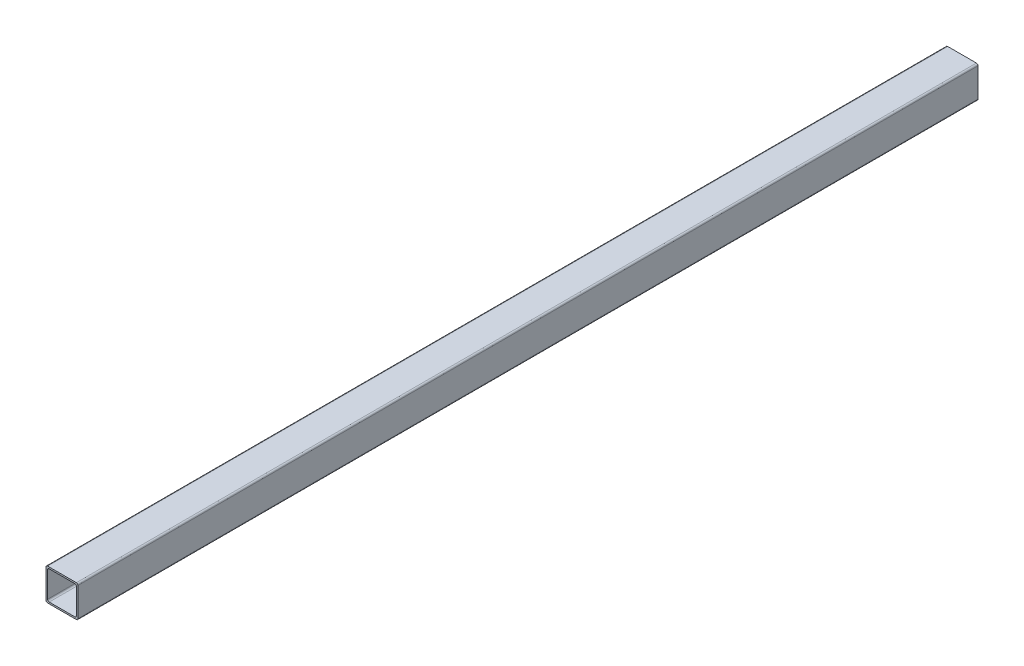
ISO-10303-21;
HEADER;
FILE_DESCRIPTION(('STEP AP214'),'2;1');
FILE_NAME('part.step','',(''),(''),'','','');
FILE_SCHEMA(('AUTOMOTIVE_DESIGN { 1 0 10303 214 1 1 1 1 }'));
ENDSEC;
DATA;
#1=APPLICATION_CONTEXT('core data for automotive mechanical design processes');
#2=APPLICATION_PROTOCOL_DEFINITION('international standard','automotive_design',2000,#1);
#3=PRODUCT_CONTEXT('',#1,'mechanical');
#4=PRODUCT('Part','Part','',(#3));
#5=PRODUCT_RELATED_PRODUCT_CATEGORY('part','',(#4));
#6=PRODUCT_DEFINITION_FORMATION('','',#4);
#7=PRODUCT_DEFINITION_CONTEXT('part definition',#1,'design');
#8=PRODUCT_DEFINITION('design','',#6,#7);
#9=PRODUCT_DEFINITION_SHAPE('','',#8);
#10=(LENGTH_UNIT() NAMED_UNIT(*) SI_UNIT(.MILLI.,.METRE.));
#11=(NAMED_UNIT(*) PLANE_ANGLE_UNIT() SI_UNIT($,.RADIAN.));
#12=(NAMED_UNIT(*) SI_UNIT($,.STERADIAN.) SOLID_ANGLE_UNIT());
#13=UNCERTAINTY_MEASURE_WITH_UNIT(LENGTH_MEASURE(1.E-05),#10,'distance_accuracy_value','');
#14=(GEOMETRIC_REPRESENTATION_CONTEXT(3) GLOBAL_UNCERTAINTY_ASSIGNED_CONTEXT((#13)) GLOBAL_UNIT_ASSIGNED_CONTEXT((#10,
#11,#12)) REPRESENTATION_CONTEXT('',''));
#15=CARTESIAN_POINT('',(0.,0.,0.));
#16=DIRECTION('',(0.,0.,1.));
#17=DIRECTION('',(1.,0.,0.));
#18=AXIS2_PLACEMENT_3D('',#15,#16,#17);
#19=CARTESIAN_POINT('',(3.,0.,1690.));
#20=DIRECTION('',(-1.,0.,0.));
#21=DIRECTION('',(0.,0.,1.));
#22=AXIS2_PLACEMENT_3D('',#19,#20,#21);
#23=PLANE('',#22);
#24=DIRECTION('',(0.,1.,0.));
#25=VECTOR('',#24,1.);
#26=CARTESIAN_POINT('',(3.,0.,0.));
#27=LINE('',#26,#25);
#28=CARTESIAN_POINT('',(3.,6.00000000000002,0.));
#29=VERTEX_POINT('',#28);
#30=CARTESIAN_POINT('',(3.,54.,0.));
#31=VERTEX_POINT('',#30);
#32=EDGE_CURVE('E207',#29,#31,#27,.T.);
#33=ORIENTED_EDGE('',*,*,#32,.T.);
#34=DIRECTION('',(0.,0.,-1.));
#35=VECTOR('',#34,1.);
#36=CARTESIAN_POINT('',(3.,54.,1690.));
#37=LINE('',#36,#35);
#38=CARTESIAN_POINT('',(3.,54.,1690.));
#39=VERTEX_POINT('',#38);
#40=EDGE_CURVE('E11',#39,#31,#37,.T.);
#41=ORIENTED_EDGE('',*,*,#40,.F.);
#42=DIRECTION('',(0.,1.,0.));
#43=VECTOR('',#42,1.);
#44=CARTESIAN_POINT('',(3.,0.,1690.));
#45=LINE('',#44,#43);
#46=CARTESIAN_POINT('',(3.,6.00000000000002,1690.));
#47=VERTEX_POINT('',#46);
#48=EDGE_CURVE('E303',#47,#39,#45,.T.);
#49=ORIENTED_EDGE('',*,*,#48,.F.);
#50=DIRECTION('',(0.,0.,-1.));
#51=VECTOR('',#50,1.);
#52=CARTESIAN_POINT('',(3.,6.00000000000002,1690.));
#53=LINE('',#52,#51);
#54=EDGE_CURVE('E54',#47,#29,#53,.T.);
#55=ORIENTED_EDGE('',*,*,#54,.T.);
#56=EDGE_LOOP('',(#33,#41,#49,#55));
#57=FACE_BOUND('',#56,.T.);
#58=ADVANCED_FACE('F34',(#57),#23,.F.);
#59=CARTESIAN_POINT('',(6.,54.,1690.));
#60=DIRECTION('',(0.,0.,-1.));
#61=DIRECTION('',(-1.,0.,0.));
#62=AXIS2_PLACEMENT_3D('',#59,#60,#61);
#63=CYLINDRICAL_SURFACE('',#62,3.);
#64=CARTESIAN_POINT('',(6.,54.,0.));
#65=DIRECTION('',(0.,0.,1.));
#66=DIRECTION('',(1.,0.,0.));
#67=AXIS2_PLACEMENT_3D('',#64,#65,#66);
#68=CIRCLE('',#67,3.);
#69=CARTESIAN_POINT('',(6.00000000000002,57.,0.));
#70=VERTEX_POINT('',#69);
#71=EDGE_CURVE('E209',#31,#70,#68,.F.);
#72=ORIENTED_EDGE('',*,*,#71,.T.);
#73=DIRECTION('',(0.,0.,-1.));
#74=VECTOR('',#73,1.);
#75=CARTESIAN_POINT('',(6.00000000000002,57.,1690.));
#76=LINE('',#75,#74);
#77=CARTESIAN_POINT('',(6.00000000000002,57.,1690.));
#78=VERTEX_POINT('',#77);
#79=EDGE_CURVE('E45',#78,#70,#76,.T.);
#80=ORIENTED_EDGE('',*,*,#79,.F.);
#81=CARTESIAN_POINT('',(6.,54.,1690.));
#82=DIRECTION('',(0.,0.,1.));
#83=DIRECTION('',(1.,0.,0.));
#84=AXIS2_PLACEMENT_3D('',#81,#82,#83);
#85=CIRCLE('',#84,3.);
#86=EDGE_CURVE('E305',#39,#78,#85,.F.);
#87=ORIENTED_EDGE('',*,*,#86,.F.);
#88=ORIENTED_EDGE('',*,*,#40,.T.);
#89=EDGE_LOOP('',(#72,#80,#87,#88));
#90=FACE_BOUND('',#89,.T.);
#91=ADVANCED_FACE('F330',(#90),#63,.F.);
#92=CARTESIAN_POINT('',(0.,57.,1690.));
#93=DIRECTION('',(0.,1.,0.));
#94=DIRECTION('',(0.,0.,1.));
#95=AXIS2_PLACEMENT_3D('',#92,#93,#94);
#96=PLANE('',#95);
#97=DIRECTION('',(1.,0.,0.));
#98=VECTOR('',#97,1.);
#99=CARTESIAN_POINT('',(0.,57.,0.));
#100=LINE('',#99,#98);
#101=CARTESIAN_POINT('',(54.,57.,0.));
#102=VERTEX_POINT('',#101);
#103=EDGE_CURVE('E211',#70,#102,#100,.T.);
#104=ORIENTED_EDGE('',*,*,#103,.T.);
#105=DIRECTION('',(0.,0.,-1.));
#106=VECTOR('',#105,1.);
#107=CARTESIAN_POINT('',(54.,57.,1690.));
#108=LINE('',#107,#106);
#109=CARTESIAN_POINT('',(54.,57.,1690.));
#110=VERTEX_POINT('',#109);
#111=EDGE_CURVE('E235',#110,#102,#108,.T.);
#112=ORIENTED_EDGE('',*,*,#111,.F.);
#113=DIRECTION('',(1.,0.,0.));
#114=VECTOR('',#113,1.);
#115=CARTESIAN_POINT('',(0.,57.,1690.));
#116=LINE('',#115,#114);
#117=EDGE_CURVE('E307',#78,#110,#116,.T.);
#118=ORIENTED_EDGE('',*,*,#117,.F.);
#119=ORIENTED_EDGE('',*,*,#79,.T.);
#120=EDGE_LOOP('',(#104,#112,#118,#119));
#121=FACE_BOUND('',#120,.T.);
#122=ADVANCED_FACE('F335',(#121),#96,.F.);
#123=CARTESIAN_POINT('',(54.,54.,1690.));
#124=DIRECTION('',(0.,0.,-1.));
#125=DIRECTION('',(-1.,0.,0.));
#126=AXIS2_PLACEMENT_3D('',#123,#124,#125);
#127=CYLINDRICAL_SURFACE('',#126,3.);
#128=CARTESIAN_POINT('',(54.,54.,0.));
#129=DIRECTION('',(0.,0.,1.));
#130=DIRECTION('',(1.,0.,0.));
#131=AXIS2_PLACEMENT_3D('',#128,#129,#130);
#132=CIRCLE('',#131,3.);
#133=CARTESIAN_POINT('',(57.,54.,0.));
#134=VERTEX_POINT('',#133);
#135=EDGE_CURVE('E213',#102,#134,#132,.F.);
#136=ORIENTED_EDGE('',*,*,#135,.T.);
#137=DIRECTION('',(0.,0.,-1.));
#138=VECTOR('',#137,1.);
#139=CARTESIAN_POINT('',(57.,54.,1690.));
#140=LINE('',#139,#138);
#141=CARTESIAN_POINT('',(57.,54.,1690.));
#142=VERTEX_POINT('',#141);
#143=EDGE_CURVE('E232',#142,#134,#140,.T.);
#144=ORIENTED_EDGE('',*,*,#143,.F.);
#145=CARTESIAN_POINT('',(54.,54.,1690.));
#146=DIRECTION('',(0.,0.,1.));
#147=DIRECTION('',(1.,0.,0.));
#148=AXIS2_PLACEMENT_3D('',#145,#146,#147);
#149=CIRCLE('',#148,3.);
#150=EDGE_CURVE('E309',#110,#142,#149,.F.);
#151=ORIENTED_EDGE('',*,*,#150,.F.);
#152=ORIENTED_EDGE('',*,*,#111,.T.);
#153=EDGE_LOOP('',(#136,#144,#151,#152));
#154=FACE_BOUND('',#153,.T.);
#155=ADVANCED_FACE('F368',(#154),#127,.F.);
#156=CARTESIAN_POINT('',(57.,0.,1690.));
#157=DIRECTION('',(-1.,0.,0.));
#158=DIRECTION('',(0.,0.,1.));
#159=AXIS2_PLACEMENT_3D('',#156,#157,#158);
#160=PLANE('',#159);
#161=DIRECTION('',(0.,1.,0.));
#162=VECTOR('',#161,1.);
#163=CARTESIAN_POINT('',(57.,0.,0.));
#164=LINE('',#163,#162);
#165=CARTESIAN_POINT('',(57.,6.00000000000002,0.));
#166=VERTEX_POINT('',#165);
#167=EDGE_CURVE('E216',#166,#134,#164,.T.);
#168=ORIENTED_EDGE('',*,*,#167,.F.);
#169=DIRECTION('',(0.,0.,-1.));
#170=VECTOR('',#169,1.);
#171=CARTESIAN_POINT('',(57.,6.00000000000002,1690.));
#172=LINE('',#171,#170);
#173=CARTESIAN_POINT('',(57.,6.00000000000002,1690.));
#174=VERTEX_POINT('',#173);
#175=EDGE_CURVE('E176',#174,#166,#172,.T.);
#176=ORIENTED_EDGE('',*,*,#175,.F.);
#177=DIRECTION('',(0.,1.,0.));
#178=VECTOR('',#177,1.);
#179=CARTESIAN_POINT('',(57.,0.,1690.));
#180=LINE('',#179,#178);
#181=EDGE_CURVE('E165',#174,#142,#180,.T.);
#182=ORIENTED_EDGE('',*,*,#181,.T.);
#183=ORIENTED_EDGE('',*,*,#143,.T.);
#184=EDGE_LOOP('',(#168,#176,#182,#183));
#185=FACE_BOUND('',#184,.T.);
#186=ADVANCED_FACE('F312',(#185),#160,.T.);
#187=CARTESIAN_POINT('',(54.,6.,1690.));
#188=DIRECTION('',(0.,0.,-1.));
#189=DIRECTION('',(-1.,0.,0.));
#190=AXIS2_PLACEMENT_3D('',#187,#188,#189);
#191=CYLINDRICAL_SURFACE('',#190,3.);
#192=CARTESIAN_POINT('',(54.,6.,0.));
#193=DIRECTION('',(0.,0.,1.));
#194=DIRECTION('',(1.,0.,0.));
#195=AXIS2_PLACEMENT_3D('',#192,#193,#194);
#196=CIRCLE('',#195,3.);
#197=CARTESIAN_POINT('',(54.,3.,0.));
#198=VERTEX_POINT('',#197);
#199=EDGE_CURVE('E172',#166,#198,#196,.F.);
#200=ORIENTED_EDGE('',*,*,#199,.T.);
#201=DIRECTION('',(0.,0.,-1.));
#202=VECTOR('',#201,1.);
#203=CARTESIAN_POINT('',(54.,3.,1690.));
#204=LINE('',#203,#202);
#205=CARTESIAN_POINT('',(54.,3.,1690.));
#206=VERTEX_POINT('',#205);
#207=EDGE_CURVE('E169',#206,#198,#204,.T.);
#208=ORIENTED_EDGE('',*,*,#207,.F.);
#209=CARTESIAN_POINT('',(54.,6.,1690.));
#210=DIRECTION('',(0.,0.,1.));
#211=DIRECTION('',(1.,0.,0.));
#212=AXIS2_PLACEMENT_3D('',#209,#210,#211);
#213=CIRCLE('',#212,3.);
#214=EDGE_CURVE('E157',#174,#206,#213,.F.);
#215=ORIENTED_EDGE('',*,*,#214,.F.);
#216=ORIENTED_EDGE('',*,*,#175,.T.);
#217=EDGE_LOOP('',(#200,#208,#215,#216));
#218=FACE_BOUND('',#217,.T.);
#219=ADVANCED_FACE('F170',(#218),#191,.F.);
#220=CARTESIAN_POINT('',(0.,3.,1690.));
#221=DIRECTION('',(0.,1.,0.));
#222=DIRECTION('',(0.,0.,1.));
#223=AXIS2_PLACEMENT_3D('',#220,#221,#222);
#224=PLANE('',#223);
#225=DIRECTION('',(1.,0.,0.));
#226=VECTOR('',#225,1.);
#227=CARTESIAN_POINT('',(0.,3.,0.));
#228=LINE('',#227,#226);
#229=CARTESIAN_POINT('',(6.00000000000002,3.,0.));
#230=VERTEX_POINT('',#229);
#231=EDGE_CURVE('E220',#230,#198,#228,.T.);
#232=ORIENTED_EDGE('',*,*,#231,.F.);
#233=DIRECTION('',(0.,0.,-1.));
#234=VECTOR('',#233,1.);
#235=CARTESIAN_POINT('',(6.00000000000002,3.,1690.));
#236=LINE('',#235,#234);
#237=CARTESIAN_POINT('',(6.00000000000002,3.,1690.));
#238=VERTEX_POINT('',#237);
#239=EDGE_CURVE('E104',#238,#230,#236,.T.);
#240=ORIENTED_EDGE('',*,*,#239,.F.);
#241=DIRECTION('',(1.,0.,0.));
#242=VECTOR('',#241,1.);
#243=CARTESIAN_POINT('',(0.,3.,1690.));
#244=LINE('',#243,#242);
#245=EDGE_CURVE('E163',#238,#206,#244,.T.);
#246=ORIENTED_EDGE('',*,*,#245,.T.);
#247=ORIENTED_EDGE('',*,*,#207,.T.);
#248=EDGE_LOOP('',(#232,#240,#246,#247));
#249=FACE_BOUND('',#248,.T.);
#250=ADVANCED_FACE('F178',(#249),#224,.T.);
#251=CARTESIAN_POINT('',(3.,57.,1690.));
#252=DIRECTION('',(0.,0.,-1.));
#253=DIRECTION('',(-1.,0.,0.));
#254=AXIS2_PLACEMENT_3D('',#251,#252,#253);
#255=CYLINDRICAL_SURFACE('',#254,3.);
#256=CARTESIAN_POINT('',(3.,57.,0.));
#257=DIRECTION('',(0.,0.,1.));
#258=DIRECTION('',(1.,0.,0.));
#259=AXIS2_PLACEMENT_3D('',#256,#257,#258);
#260=CIRCLE('',#259,3.);
#261=CARTESIAN_POINT('',(0.,57.,0.));
#262=VERTEX_POINT('',#261);
#263=CARTESIAN_POINT('',(3.00000000000002,60.,0.));
#264=VERTEX_POINT('',#263);
#265=EDGE_CURVE('E185',#262,#264,#260,.F.);
#266=ORIENTED_EDGE('',*,*,#265,.F.);
#267=DIRECTION('',(0.,0.,-1.));
#268=VECTOR('',#267,1.);
#269=CARTESIAN_POINT('',(0.,57.,1690.));
#270=LINE('',#269,#268);
#271=CARTESIAN_POINT('',(0.,57.,1690.));
#272=VERTEX_POINT('',#271);
#273=EDGE_CURVE('E38',#272,#262,#270,.T.);
#274=ORIENTED_EDGE('',*,*,#273,.F.);
#275=CARTESIAN_POINT('',(3.,57.,1690.));
#276=DIRECTION('',(0.,0.,1.));
#277=DIRECTION('',(1.,0.,0.));
#278=AXIS2_PLACEMENT_3D('',#275,#276,#277);
#279=CIRCLE('',#278,3.);
#280=CARTESIAN_POINT('',(3.00000000000002,60.,1690.));
#281=VERTEX_POINT('',#280);
#282=EDGE_CURVE('E225',#272,#281,#279,.F.);
#283=ORIENTED_EDGE('',*,*,#282,.T.);
#284=DIRECTION('',(0.,0.,-1.));
#285=VECTOR('',#284,1.);
#286=CARTESIAN_POINT('',(3.00000000000002,60.,1690.));
#287=LINE('',#286,#285);
#288=EDGE_CURVE('E181',#281,#264,#287,.T.);
#289=ORIENTED_EDGE('',*,*,#288,.T.);
#290=EDGE_LOOP('',(#266,#274,#283,#289));
#291=FACE_BOUND('',#290,.T.);
#292=ADVANCED_FACE('F36',(#291),#255,.T.);
#293=CARTESIAN_POINT('',(0.,0.,1690.));
#294=DIRECTION('',(-1.,0.,0.));
#295=DIRECTION('',(0.,0.,1.));
#296=AXIS2_PLACEMENT_3D('',#293,#294,#295);
#297=PLANE('',#296);
#298=DIRECTION('',(0.,1.,0.));
#299=VECTOR('',#298,1.);
#300=CARTESIAN_POINT('',(0.,0.,0.));
#301=LINE('',#300,#299);
#302=CARTESIAN_POINT('',(0.,3.00000000000002,0.));
#303=VERTEX_POINT('',#302);
#304=EDGE_CURVE('E188',#303,#262,#301,.T.);
#305=ORIENTED_EDGE('',*,*,#304,.F.);
#306=DIRECTION('',(0.,0.,-1.));
#307=VECTOR('',#306,1.);
#308=CARTESIAN_POINT('',(0.,3.00000000000002,1690.));
#309=LINE('',#308,#307);
#310=CARTESIAN_POINT('',(0.,3.00000000000002,1690.));
#311=VERTEX_POINT('',#310);
#312=EDGE_CURVE('E260',#311,#303,#309,.T.);
#313=ORIENTED_EDGE('',*,*,#312,.F.);
#314=DIRECTION('',(0.,1.,0.));
#315=VECTOR('',#314,1.);
#316=CARTESIAN_POINT('',(0.,0.,1690.));
#317=LINE('',#316,#315);
#318=EDGE_CURVE('E271',#311,#272,#317,.T.);
#319=ORIENTED_EDGE('',*,*,#318,.T.);
#320=ORIENTED_EDGE('',*,*,#273,.T.);
#321=EDGE_LOOP('',(#305,#313,#319,#320));
#322=FACE_BOUND('',#321,.T.);
#323=ADVANCED_FACE('F269',(#322),#297,.T.);
#324=CARTESIAN_POINT('',(3.,3.,1690.));
#325=DIRECTION('',(0.,0.,-1.));
#326=DIRECTION('',(-1.,0.,0.));
#327=AXIS2_PLACEMENT_3D('',#324,#325,#326);
#328=CYLINDRICAL_SURFACE('',#327,3.);
#329=CARTESIAN_POINT('',(3.,3.,0.));
#330=DIRECTION('',(0.,0.,1.));
#331=DIRECTION('',(1.,0.,0.));
#332=AXIS2_PLACEMENT_3D('',#329,#330,#331);
#333=CIRCLE('',#332,3.);
#334=CARTESIAN_POINT('',(3.00000000000002,0.,0.));
#335=VERTEX_POINT('',#334);
#336=EDGE_CURVE('E191',#335,#303,#333,.F.);
#337=ORIENTED_EDGE('',*,*,#336,.F.);
#338=DIRECTION('',(0.,0.,-1.));
#339=VECTOR('',#338,1.);
#340=CARTESIAN_POINT('',(3.00000000000002,0.,1690.));
#341=LINE('',#340,#339);
#342=CARTESIAN_POINT('',(3.00000000000002,0.,1690.));
#343=VERTEX_POINT('',#342);
#344=EDGE_CURVE('E258',#343,#335,#341,.T.);
#345=ORIENTED_EDGE('',*,*,#344,.F.);
#346=CARTESIAN_POINT('',(3.,3.,1690.));
#347=DIRECTION('',(0.,0.,1.));
#348=DIRECTION('',(1.,0.,0.));
#349=AXIS2_PLACEMENT_3D('',#346,#347,#348);
#350=CIRCLE('',#349,3.);
#351=EDGE_CURVE('E281',#343,#311,#350,.F.);
#352=ORIENTED_EDGE('',*,*,#351,.T.);
#353=ORIENTED_EDGE('',*,*,#312,.T.);
#354=EDGE_LOOP('',(#337,#345,#352,#353));
#355=FACE_BOUND('',#354,.T.);
#356=ADVANCED_FACE('F278',(#355),#328,.T.);
#357=CARTESIAN_POINT('',(0.,0.,1690.));
#358=DIRECTION('',(0.,1.,0.));
#359=DIRECTION('',(0.,0.,1.));
#360=AXIS2_PLACEMENT_3D('',#357,#358,#359);
#361=PLANE('',#360);
#362=DIRECTION('',(1.,0.,0.));
#363=VECTOR('',#362,1.);
#364=CARTESIAN_POINT('',(0.,0.,0.));
#365=LINE('',#364,#363);
#366=CARTESIAN_POINT('',(57.,0.,0.));
#367=VERTEX_POINT('',#366);
#368=EDGE_CURVE('E194',#335,#367,#365,.T.);
#369=ORIENTED_EDGE('',*,*,#368,.T.);
#370=DIRECTION('',(0.,0.,-1.));
#371=VECTOR('',#370,1.);
#372=CARTESIAN_POINT('',(57.,0.,1690.));
#373=LINE('',#372,#371);
#374=CARTESIAN_POINT('',(57.,0.,1690.));
#375=VERTEX_POINT('',#374);
#376=EDGE_CURVE('E254',#375,#367,#373,.T.);
#377=ORIENTED_EDGE('',*,*,#376,.F.);
#378=DIRECTION('',(1.,0.,0.));
#379=VECTOR('',#378,1.);
#380=CARTESIAN_POINT('',(0.,0.,1690.));
#381=LINE('',#380,#379);
#382=EDGE_CURVE('E284',#343,#375,#381,.T.);
#383=ORIENTED_EDGE('',*,*,#382,.F.);
#384=ORIENTED_EDGE('',*,*,#344,.T.);
#385=EDGE_LOOP('',(#369,#377,#383,#384));
#386=FACE_BOUND('',#385,.T.);
#387=ADVANCED_FACE('F285',(#386),#361,.F.);
#388=CARTESIAN_POINT('',(57.,3.,1690.));
#389=DIRECTION('',(0.,0.,-1.));
#390=DIRECTION('',(-1.,0.,0.));
#391=AXIS2_PLACEMENT_3D('',#388,#389,#390);
#392=CYLINDRICAL_SURFACE('',#391,3.);
#393=CARTESIAN_POINT('',(57.,3.,0.));
#394=DIRECTION('',(0.,0.,1.));
#395=DIRECTION('',(1.,0.,0.));
#396=AXIS2_PLACEMENT_3D('',#393,#394,#395);
#397=CIRCLE('',#396,3.);
#398=CARTESIAN_POINT('',(60.,3.00000000000002,0.));
#399=VERTEX_POINT('',#398);
#400=EDGE_CURVE('E196',#367,#399,#397,.T.);
#401=ORIENTED_EDGE('',*,*,#400,.T.);
#402=DIRECTION('',(0.,0.,-1.));
#403=VECTOR('',#402,1.);
#404=CARTESIAN_POINT('',(60.,3.00000000000002,1690.));
#405=LINE('',#404,#403);
#406=CARTESIAN_POINT('',(60.,3.00000000000002,1690.));
#407=VERTEX_POINT('',#406);
#408=EDGE_CURVE('E250',#407,#399,#405,.T.);
#409=ORIENTED_EDGE('',*,*,#408,.F.);
#410=CARTESIAN_POINT('',(57.,3.,1690.));
#411=DIRECTION('',(0.,0.,1.));
#412=DIRECTION('',(1.,0.,0.));
#413=AXIS2_PLACEMENT_3D('',#410,#411,#412);
#414=CIRCLE('',#413,3.);
#415=EDGE_CURVE('E288',#375,#407,#414,.T.);
#416=ORIENTED_EDGE('',*,*,#415,.F.);
#417=ORIENTED_EDGE('',*,*,#376,.T.);
#418=EDGE_LOOP('',(#401,#409,#416,#417));
#419=FACE_BOUND('',#418,.T.);
#420=ADVANCED_FACE('F346',(#419),#392,.T.);
#421=CARTESIAN_POINT('',(60.,0.,1690.));
#422=DIRECTION('',(-1.,0.,0.));
#423=DIRECTION('',(0.,0.,1.));
#424=AXIS2_PLACEMENT_3D('',#421,#422,#423);
#425=PLANE('',#424);
#426=DIRECTION('',(0.,1.,0.));
#427=VECTOR('',#426,1.);
#428=CARTESIAN_POINT('',(60.,0.,0.));
#429=LINE('',#428,#427);
#430=CARTESIAN_POINT('',(60.,57.,0.));
#431=VERTEX_POINT('',#430);
#432=EDGE_CURVE('E198',#399,#431,#429,.T.);
#433=ORIENTED_EDGE('',*,*,#432,.T.);
#434=DIRECTION('',(0.,0.,-1.));
#435=VECTOR('',#434,1.);
#436=CARTESIAN_POINT('',(60.,57.,1690.));
#437=LINE('',#436,#435);
#438=CARTESIAN_POINT('',(60.,57.,1690.));
#439=VERTEX_POINT('',#438);
#440=EDGE_CURVE('E247',#439,#431,#437,.T.);
#441=ORIENTED_EDGE('',*,*,#440,.F.);
#442=DIRECTION('',(0.,1.,0.));
#443=VECTOR('',#442,1.);
#444=CARTESIAN_POINT('',(60.,0.,1690.));
#445=LINE('',#444,#443);
#446=EDGE_CURVE('E295',#407,#439,#445,.T.);
#447=ORIENTED_EDGE('',*,*,#446,.F.);
#448=ORIENTED_EDGE('',*,*,#408,.T.);
#449=EDGE_LOOP('',(#433,#441,#447,#448));
#450=FACE_BOUND('',#449,.T.);
#451=ADVANCED_FACE('F342',(#450),#425,.F.);
#452=CARTESIAN_POINT('',(57.,57.,1690.));
#453=DIRECTION('',(0.,0.,-1.));
#454=DIRECTION('',(-1.,0.,0.));
#455=AXIS2_PLACEMENT_3D('',#452,#453,#454);
#456=CYLINDRICAL_SURFACE('',#455,3.);
#457=CARTESIAN_POINT('',(57.,57.,0.));
#458=DIRECTION('',(0.,0.,1.));
#459=DIRECTION('',(1.,0.,0.));
#460=AXIS2_PLACEMENT_3D('',#457,#458,#459);
#461=CIRCLE('',#460,3.);
#462=CARTESIAN_POINT('',(57.,60.,0.));
#463=VERTEX_POINT('',#462);
#464=EDGE_CURVE('E201',#463,#431,#461,.F.);
#465=ORIENTED_EDGE('',*,*,#464,.F.);
#466=DIRECTION('',(0.,0.,-1.));
#467=VECTOR('',#466,1.);
#468=CARTESIAN_POINT('',(57.,60.,1690.));
#469=LINE('',#468,#467);
#470=CARTESIAN_POINT('',(57.,60.,1690.));
#471=VERTEX_POINT('',#470);
#472=EDGE_CURVE('E244',#471,#463,#469,.T.);
#473=ORIENTED_EDGE('',*,*,#472,.F.);
#474=CARTESIAN_POINT('',(57.,57.,1690.));
#475=DIRECTION('',(0.,0.,1.));
#476=DIRECTION('',(1.,0.,0.));
#477=AXIS2_PLACEMENT_3D('',#474,#475,#476);
#478=CIRCLE('',#477,3.);
#479=EDGE_CURVE('E297',#471,#439,#478,.F.);
#480=ORIENTED_EDGE('',*,*,#479,.T.);
#481=ORIENTED_EDGE('',*,*,#440,.T.);
#482=EDGE_LOOP('',(#465,#473,#480,#481));
#483=FACE_BOUND('',#482,.T.);
#484=ADVANCED_FACE('F324',(#483),#456,.T.);
#485=CARTESIAN_POINT('',(0.,60.,1690.));
#486=DIRECTION('',(0.,1.,0.));
#487=DIRECTION('',(0.,0.,1.));
#488=AXIS2_PLACEMENT_3D('',#485,#486,#487);
#489=PLANE('',#488);
#490=DIRECTION('',(1.,0.,0.));
#491=VECTOR('',#490,1.);
#492=CARTESIAN_POINT('',(0.,60.,0.));
#493=LINE('',#492,#491);
#494=EDGE_CURVE('E204',#264,#463,#493,.T.);
#495=ORIENTED_EDGE('',*,*,#494,.F.);
#496=ORIENTED_EDGE('',*,*,#288,.F.);
#497=DIRECTION('',(1.,0.,0.));
#498=VECTOR('',#497,1.);
#499=CARTESIAN_POINT('',(0.,60.,1690.));
#500=LINE('',#499,#498);
#501=EDGE_CURVE('E300',#281,#471,#500,.T.);
#502=ORIENTED_EDGE('',*,*,#501,.T.);
#503=ORIENTED_EDGE('',*,*,#472,.T.);
#504=EDGE_LOOP('',(#495,#496,#502,#503));
#505=FACE_BOUND('',#504,.T.);
#506=ADVANCED_FACE('F317',(#505),#489,.T.);
#507=CARTESIAN_POINT('',(6.,6.,1690.));
#508=DIRECTION('',(0.,0.,-1.));
#509=DIRECTION('',(-1.,0.,0.));
#510=AXIS2_PLACEMENT_3D('',#507,#508,#509);
#511=CYLINDRICAL_SURFACE('',#510,3.);
#512=CARTESIAN_POINT('',(6.,6.,0.));
#513=DIRECTION('',(0.,0.,1.));
#514=DIRECTION('',(1.,0.,0.));
#515=AXIS2_PLACEMENT_3D('',#512,#513,#514);
#516=CIRCLE('',#515,3.);
#517=EDGE_CURVE('E222',#29,#230,#516,.T.);
#518=ORIENTED_EDGE('',*,*,#517,.F.);
#519=ORIENTED_EDGE('',*,*,#54,.F.);
#520=CARTESIAN_POINT('',(6.,6.,1690.));
#521=DIRECTION('',(0.,0.,1.));
#522=DIRECTION('',(1.,0.,0.));
#523=AXIS2_PLACEMENT_3D('',#520,#521,#522);
#524=CIRCLE('',#523,3.);
#525=EDGE_CURVE('E179',#47,#238,#524,.T.);
#526=ORIENTED_EDGE('',*,*,#525,.T.);
#527=ORIENTED_EDGE('',*,*,#239,.T.);
#528=EDGE_LOOP('',(#518,#519,#526,#527));
#529=FACE_BOUND('',#528,.T.);
#530=ADVANCED_FACE('F315',(#529),#511,.F.);
#531=CARTESIAN_POINT('',(0.,0.,1690.));
#532=DIRECTION('',(0.,0.,1.));
#533=DIRECTION('',(1.,0.,0.));
#534=AXIS2_PLACEMENT_3D('',#531,#532,#533);
#535=PLANE('',#534);
#536=ORIENTED_EDGE('',*,*,#282,.F.);
#537=ORIENTED_EDGE('',*,*,#318,.F.);
#538=ORIENTED_EDGE('',*,*,#351,.F.);
#539=ORIENTED_EDGE('',*,*,#382,.T.);
#540=ORIENTED_EDGE('',*,*,#415,.T.);
#541=ORIENTED_EDGE('',*,*,#446,.T.);
#542=ORIENTED_EDGE('',*,*,#479,.F.);
#543=ORIENTED_EDGE('',*,*,#501,.F.);
#544=EDGE_LOOP('',(#536,#537,#538,#539,#540,#541,#542,#543));
#545=FACE_BOUND('',#544,.T.);
#546=ORIENTED_EDGE('',*,*,#48,.T.);
#547=ORIENTED_EDGE('',*,*,#86,.T.);
#548=ORIENTED_EDGE('',*,*,#117,.T.);
#549=ORIENTED_EDGE('',*,*,#150,.T.);
#550=ORIENTED_EDGE('',*,*,#181,.F.);
#551=ORIENTED_EDGE('',*,*,#214,.T.);
#552=ORIENTED_EDGE('',*,*,#245,.F.);
#553=ORIENTED_EDGE('',*,*,#525,.F.);
#554=EDGE_LOOP('',(#546,#547,#548,#549,#550,#551,#552,#553));
#555=FACE_BOUND('',#554,.T.);
#556=ADVANCED_FACE('F160',(#545,#555),#535,.T.);
#557=CARTESIAN_POINT('',(0.,0.,0.));
#558=DIRECTION('',(0.,0.,1.));
#559=DIRECTION('',(1.,0.,0.));
#560=AXIS2_PLACEMENT_3D('',#557,#558,#559);
#561=PLANE('',#560);
#562=ORIENTED_EDGE('',*,*,#265,.T.);
#563=ORIENTED_EDGE('',*,*,#494,.T.);
#564=ORIENTED_EDGE('',*,*,#464,.T.);
#565=ORIENTED_EDGE('',*,*,#432,.F.);
#566=ORIENTED_EDGE('',*,*,#400,.F.);
#567=ORIENTED_EDGE('',*,*,#368,.F.);
#568=ORIENTED_EDGE('',*,*,#336,.T.);
#569=ORIENTED_EDGE('',*,*,#304,.T.);
#570=EDGE_LOOP('',(#562,#563,#564,#565,#566,#567,#568,#569));
#571=FACE_BOUND('',#570,.T.);
#572=ORIENTED_EDGE('',*,*,#32,.F.);
#573=ORIENTED_EDGE('',*,*,#517,.T.);
#574=ORIENTED_EDGE('',*,*,#231,.T.);
#575=ORIENTED_EDGE('',*,*,#199,.F.);
#576=ORIENTED_EDGE('',*,*,#167,.T.);
#577=ORIENTED_EDGE('',*,*,#135,.F.);
#578=ORIENTED_EDGE('',*,*,#103,.F.);
#579=ORIENTED_EDGE('',*,*,#71,.F.);
#580=EDGE_LOOP('',(#572,#573,#574,#575,#576,#577,#578,#579));
#581=FACE_BOUND('',#580,.T.);
#582=ADVANCED_FACE('F274',(#571,#581),#561,.F.);
#583=CLOSED_SHELL('',(#58,#91,#122,#155,#186,#219,#250,#292,#323,#356,#387,#420,#451,#484,#506,
#530,#556,#582));
#584=MANIFOLD_SOLID_BREP('B2',#583);
#585=ADVANCED_BREP_SHAPE_REPRESENTATION('',(#18,#584),#14);
#586=SHAPE_DEFINITION_REPRESENTATION(#9,#585);
ENDSEC;
END-ISO-10303-21;
